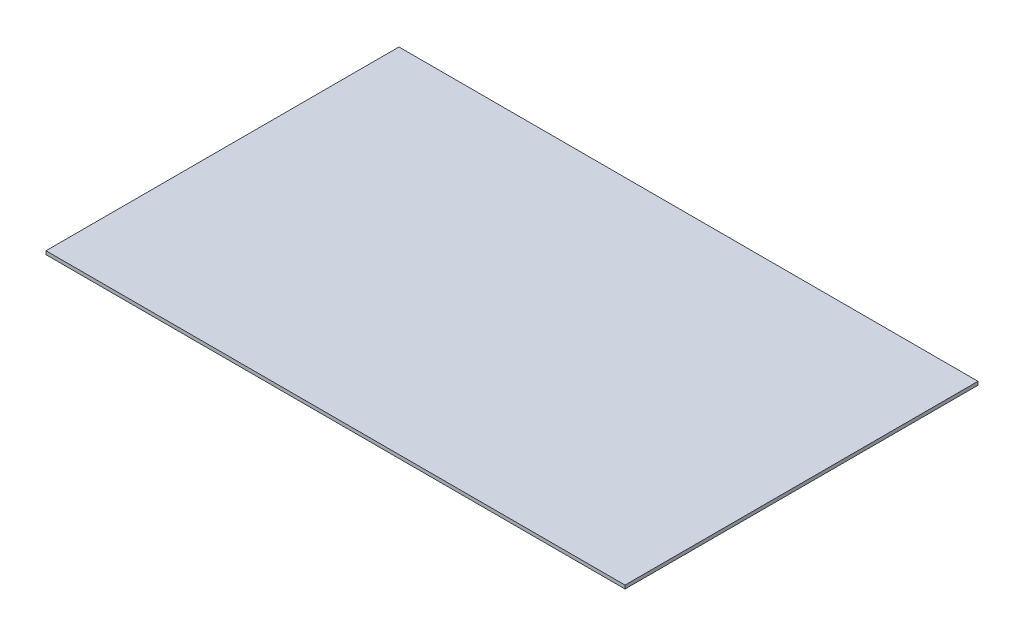
ISO-10303-21;
HEADER;
FILE_DESCRIPTION(('STEP AP214'),'2;1');
FILE_NAME('part.step','',(''),(''),'','','');
FILE_SCHEMA(('AUTOMOTIVE_DESIGN { 1 0 10303 214 1 1 1 1 }'));
ENDSEC;
DATA;
#1=APPLICATION_CONTEXT('core data for automotive mechanical design processes');
#2=APPLICATION_PROTOCOL_DEFINITION('international standard','automotive_design',2000,#1);
#3=PRODUCT_CONTEXT('',#1,'mechanical');
#4=PRODUCT('Part','Part','',(#3));
#5=PRODUCT_RELATED_PRODUCT_CATEGORY('part','',(#4));
#6=PRODUCT_DEFINITION_FORMATION('','',#4);
#7=PRODUCT_DEFINITION_CONTEXT('part definition',#1,'design');
#8=PRODUCT_DEFINITION('design','',#6,#7);
#9=PRODUCT_DEFINITION_SHAPE('','',#8);
#10=(LENGTH_UNIT() NAMED_UNIT(*) SI_UNIT(.MILLI.,.METRE.));
#11=(NAMED_UNIT(*) PLANE_ANGLE_UNIT() SI_UNIT($,.RADIAN.));
#12=(NAMED_UNIT(*) SI_UNIT($,.STERADIAN.) SOLID_ANGLE_UNIT());
#13=UNCERTAINTY_MEASURE_WITH_UNIT(LENGTH_MEASURE(1.E-05),#10,'distance_accuracy_value','');
#14=(GEOMETRIC_REPRESENTATION_CONTEXT(3) GLOBAL_UNCERTAINTY_ASSIGNED_CONTEXT((#13)) GLOBAL_UNIT_ASSIGNED_CONTEXT((#10,
#11,#12)) REPRESENTATION_CONTEXT('',''));
#15=CARTESIAN_POINT('',(0.,0.,0.));
#16=DIRECTION('',(0.,0.,1.));
#17=DIRECTION('',(1.,0.,0.));
#18=AXIS2_PLACEMENT_3D('',#15,#16,#17);
#19=CARTESIAN_POINT('',(133.35,1.5875,-81.28));
#20=DIRECTION('',(-1.,0.,0.));
#21=DIRECTION('',(0.,0.,1.));
#22=AXIS2_PLACEMENT_3D('',#19,#20,#21);
#23=PLANE('',#22);
#24=DIRECTION('',(0.,0.,-1.));
#25=VECTOR('',#24,1.);
#26=CARTESIAN_POINT('',(133.35,0.,-81.28));
#27=LINE('',#26,#25);
#28=CARTESIAN_POINT('',(133.35,0.,81.28));
#29=VERTEX_POINT('',#28);
#30=CARTESIAN_POINT('',(133.35,0.,-81.28));
#31=VERTEX_POINT('',#30);
#32=EDGE_CURVE('E111',#29,#31,#27,.T.);
#33=ORIENTED_EDGE('',*,*,#32,.T.);
#34=DIRECTION('',(0.,-1.,0.));
#35=VECTOR('',#34,1.);
#36=CARTESIAN_POINT('',(133.35,1.5875,-81.28));
#37=LINE('',#36,#35);
#38=CARTESIAN_POINT('',(133.35,1.5875,-81.28));
#39=VERTEX_POINT('',#38);
#40=EDGE_CURVE('E11',#39,#31,#37,.T.);
#41=ORIENTED_EDGE('',*,*,#40,.F.);
#42=DIRECTION('',(0.,0.,-1.));
#43=VECTOR('',#42,1.);
#44=CARTESIAN_POINT('',(133.35,1.5875,-81.28));
#45=LINE('',#44,#43);
#46=CARTESIAN_POINT('',(133.35,1.5875,81.28));
#47=VERTEX_POINT('',#46);
#48=EDGE_CURVE('E95',#47,#39,#45,.T.);
#49=ORIENTED_EDGE('',*,*,#48,.F.);
#50=DIRECTION('',(0.,-1.,0.));
#51=VECTOR('',#50,1.);
#52=CARTESIAN_POINT('',(133.35,1.5875,81.28));
#53=LINE('',#52,#51);
#54=EDGE_CURVE('E107',#47,#29,#53,.T.);
#55=ORIENTED_EDGE('',*,*,#54,.T.);
#56=EDGE_LOOP('',(#33,#41,#49,#55));
#57=FACE_BOUND('',#56,.T.);
#58=ADVANCED_FACE('F43',(#57),#23,.F.);
#59=CARTESIAN_POINT('',(-133.35,1.5875,-81.28));
#60=DIRECTION('',(0.,0.,1.));
#61=DIRECTION('',(1.,0.,0.));
#62=AXIS2_PLACEMENT_3D('',#59,#60,#61);
#63=PLANE('',#62);
#64=DIRECTION('',(-1.,0.,0.));
#65=VECTOR('',#64,1.);
#66=CARTESIAN_POINT('',(-133.35,0.,-81.28));
#67=LINE('',#66,#65);
#68=CARTESIAN_POINT('',(-133.35,0.,-81.28));
#69=VERTEX_POINT('',#68);
#70=EDGE_CURVE('E100',#31,#69,#67,.T.);
#71=ORIENTED_EDGE('',*,*,#70,.T.);
#72=DIRECTION('',(0.,-1.,0.));
#73=VECTOR('',#72,1.);
#74=CARTESIAN_POINT('',(-133.35,1.5875,-81.28));
#75=LINE('',#74,#73);
#76=CARTESIAN_POINT('',(-133.35,1.5875,-81.28));
#77=VERTEX_POINT('',#76);
#78=EDGE_CURVE('E52',#77,#69,#75,.T.);
#79=ORIENTED_EDGE('',*,*,#78,.F.);
#80=DIRECTION('',(-1.,0.,0.));
#81=VECTOR('',#80,1.);
#82=CARTESIAN_POINT('',(-133.35,1.5875,-81.28));
#83=LINE('',#82,#81);
#84=EDGE_CURVE('E90',#39,#77,#83,.T.);
#85=ORIENTED_EDGE('',*,*,#84,.F.);
#86=ORIENTED_EDGE('',*,*,#40,.T.);
#87=EDGE_LOOP('',(#71,#79,#85,#86));
#88=FACE_BOUND('',#87,.T.);
#89=ADVANCED_FACE('F99',(#88),#63,.F.);
#90=CARTESIAN_POINT('',(-133.35,1.5875,-81.28));
#91=DIRECTION('',(1.,0.,0.));
#92=DIRECTION('',(0.,0.,-1.));
#93=AXIS2_PLACEMENT_3D('',#90,#91,#92);
#94=PLANE('',#93);
#95=DIRECTION('',(0.,0.,1.));
#96=VECTOR('',#95,1.);
#97=CARTESIAN_POINT('',(-133.35,0.,-81.28));
#98=LINE('',#97,#96);
#99=CARTESIAN_POINT('',(-133.35,0.,81.28));
#100=VERTEX_POINT('',#99);
#101=EDGE_CURVE('E77',#69,#100,#98,.T.);
#102=ORIENTED_EDGE('',*,*,#101,.T.);
#103=DIRECTION('',(0.,-1.,0.));
#104=VECTOR('',#103,1.);
#105=CARTESIAN_POINT('',(-133.35,1.5875,81.28));
#106=LINE('',#105,#104);
#107=CARTESIAN_POINT('',(-133.35,1.5875,81.28));
#108=VERTEX_POINT('',#107);
#109=EDGE_CURVE('E102',#108,#100,#106,.T.);
#110=ORIENTED_EDGE('',*,*,#109,.F.);
#111=DIRECTION('',(0.,0.,1.));
#112=VECTOR('',#111,1.);
#113=CARTESIAN_POINT('',(-133.35,1.5875,-81.28));
#114=LINE('',#113,#112);
#115=EDGE_CURVE('E93',#77,#108,#114,.T.);
#116=ORIENTED_EDGE('',*,*,#115,.F.);
#117=ORIENTED_EDGE('',*,*,#78,.T.);
#118=EDGE_LOOP('',(#102,#110,#116,#117));
#119=FACE_BOUND('',#118,.T.);
#120=ADVANCED_FACE('F103',(#119),#94,.F.);
#121=CARTESIAN_POINT('',(-133.35,1.5875,81.28));
#122=DIRECTION('',(0.,0.,-1.));
#123=DIRECTION('',(-1.,0.,0.));
#124=AXIS2_PLACEMENT_3D('',#121,#122,#123);
#125=PLANE('',#124);
#126=DIRECTION('',(1.,0.,0.));
#127=VECTOR('',#126,1.);
#128=CARTESIAN_POINT('',(-133.35,0.,81.28));
#129=LINE('',#128,#127);
#130=EDGE_CURVE('E83',#100,#29,#129,.T.);
#131=ORIENTED_EDGE('',*,*,#130,.T.);
#132=ORIENTED_EDGE('',*,*,#54,.F.);
#133=DIRECTION('',(1.,0.,0.));
#134=VECTOR('',#133,1.);
#135=CARTESIAN_POINT('',(-133.35,1.5875,81.28));
#136=LINE('',#135,#134);
#137=EDGE_CURVE('E60',#108,#47,#136,.T.);
#138=ORIENTED_EDGE('',*,*,#137,.F.);
#139=ORIENTED_EDGE('',*,*,#109,.T.);
#140=EDGE_LOOP('',(#131,#132,#138,#139));
#141=FACE_BOUND('',#140,.T.);
#142=ADVANCED_FACE('F124',(#141),#125,.F.);
#143=CARTESIAN_POINT('',(0.,1.5875,0.));
#144=DIRECTION('',(0.,1.,0.));
#145=DIRECTION('',(0.,0.,1.));
#146=AXIS2_PLACEMENT_3D('',#143,#144,#145);
#147=PLANE('',#146);
#148=ORIENTED_EDGE('',*,*,#48,.T.);
#149=ORIENTED_EDGE('',*,*,#84,.T.);
#150=ORIENTED_EDGE('',*,*,#115,.T.);
#151=ORIENTED_EDGE('',*,*,#137,.T.);
#152=EDGE_LOOP('',(#148,#149,#150,#151));
#153=FACE_BOUND('',#152,.T.);
#154=ADVANCED_FACE('F91',(#153),#147,.T.);
#155=CARTESIAN_POINT('',(0.,0.,0.));
#156=DIRECTION('',(0.,1.,0.));
#157=DIRECTION('',(0.,0.,1.));
#158=AXIS2_PLACEMENT_3D('',#155,#156,#157);
#159=PLANE('',#158);
#160=ORIENTED_EDGE('',*,*,#32,.F.);
#161=ORIENTED_EDGE('',*,*,#130,.F.);
#162=ORIENTED_EDGE('',*,*,#101,.F.);
#163=ORIENTED_EDGE('',*,*,#70,.F.);
#164=EDGE_LOOP('',(#160,#161,#162,#163));
#165=FACE_BOUND('',#164,.T.);
#166=ADVANCED_FACE('F127',(#165),#159,.F.);
#167=CLOSED_SHELL('',(#58,#89,#120,#142,#154,#166));
#168=MANIFOLD_SOLID_BREP('B2',#167);
#169=ADVANCED_BREP_SHAPE_REPRESENTATION('',(#18,#168),#14);
#170=SHAPE_DEFINITION_REPRESENTATION(#9,#169);
ENDSEC;
END-ISO-10303-21;
